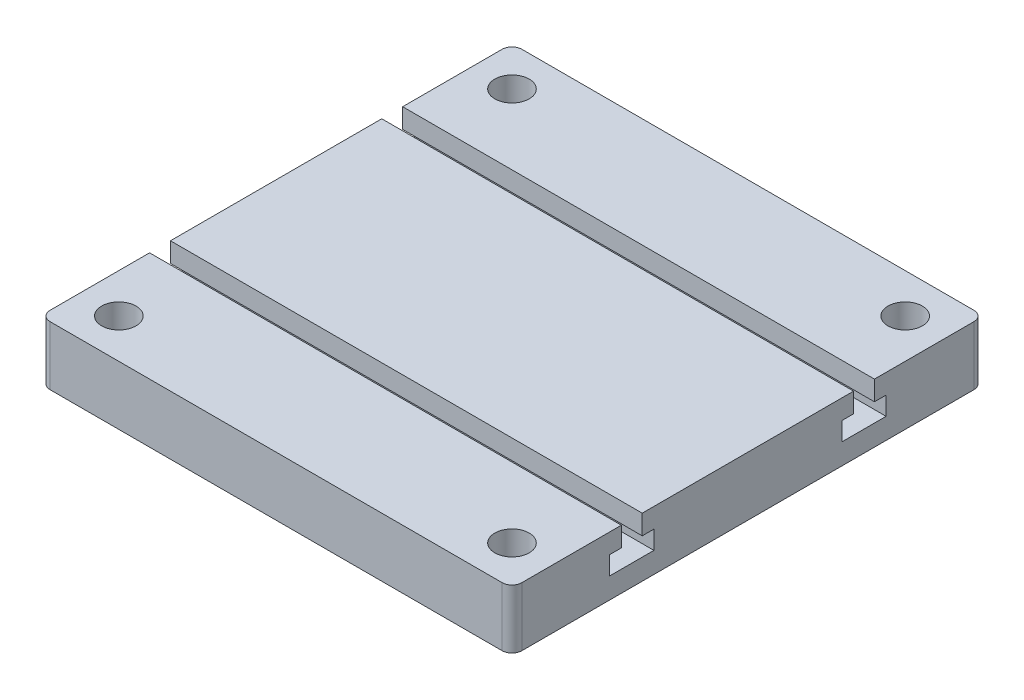
ISO-10303-21;
HEADER;
FILE_DESCRIPTION(('STEP AP214'),'2;1');
FILE_NAME('part.step','',(''),(''),'','','');
FILE_SCHEMA(('AUTOMOTIVE_DESIGN { 1 0 10303 214 1 1 1 1 }'));
ENDSEC;
DATA;
#1=APPLICATION_CONTEXT('core data for automotive mechanical design processes');
#2=APPLICATION_PROTOCOL_DEFINITION('international standard','automotive_design',2000,#1);
#3=PRODUCT_CONTEXT('',#1,'mechanical');
#4=PRODUCT('Part','Part','',(#3));
#5=PRODUCT_RELATED_PRODUCT_CATEGORY('part','',(#4));
#6=PRODUCT_DEFINITION_FORMATION('','',#4);
#7=PRODUCT_DEFINITION_CONTEXT('part definition',#1,'design');
#8=PRODUCT_DEFINITION('design','',#6,#7);
#9=PRODUCT_DEFINITION_SHAPE('','',#8);
#10=(LENGTH_UNIT() NAMED_UNIT(*) SI_UNIT(.MILLI.,.METRE.));
#11=(NAMED_UNIT(*) PLANE_ANGLE_UNIT() SI_UNIT($,.RADIAN.));
#12=(NAMED_UNIT(*) SI_UNIT($,.STERADIAN.) SOLID_ANGLE_UNIT());
#13=UNCERTAINTY_MEASURE_WITH_UNIT(LENGTH_MEASURE(1.E-05),#10,'distance_accuracy_value','');
#14=(GEOMETRIC_REPRESENTATION_CONTEXT(3) GLOBAL_UNCERTAINTY_ASSIGNED_CONTEXT((#13)) GLOBAL_UNIT_ASSIGNED_CONTEXT((#10,
#11,#12)) REPRESENTATION_CONTEXT('',''));
#15=CARTESIAN_POINT('',(0.,0.,0.));
#16=DIRECTION('',(0.,0.,1.));
#17=DIRECTION('',(1.,0.,0.));
#18=AXIS2_PLACEMENT_3D('',#15,#16,#17);
#19=CARTESIAN_POINT('',(76.2,19.05,-76.2));
#20=DIRECTION('',(-1.,0.,0.));
#21=DIRECTION('',(0.,0.,1.));
#22=AXIS2_PLACEMENT_3D('',#19,#20,#21);
#23=PLANE('',#22);
#24=DIRECTION('',(0.,0.,-1.));
#25=VECTOR('',#24,1.);
#26=CARTESIAN_POINT('',(76.2,19.05,-76.2));
#27=LINE('',#26,#25);
#28=CARTESIAN_POINT('',(76.2,19.05,73.0249999999999));
#29=VERTEX_POINT('',#28);
#30=CARTESIAN_POINT('',(76.2,19.05,40.8765375));
#31=VERTEX_POINT('',#30);
#32=EDGE_CURVE('E195',#29,#31,#27,.T.);
#33=ORIENTED_EDGE('',*,*,#32,.F.);
#34=DIRECTION('',(0.,-1.,0.));
#35=VECTOR('',#34,1.);
#36=CARTESIAN_POINT('',(76.2,19.05,73.025));
#37=LINE('',#36,#35);
#38=CARTESIAN_POINT('',(76.2,0.,73.0249999999999));
#39=VERTEX_POINT('',#38);
#40=EDGE_CURVE('E411',#29,#39,#37,.T.);
#41=ORIENTED_EDGE('',*,*,#40,.T.);
#42=DIRECTION('',(0.,0.,-1.));
#43=VECTOR('',#42,1.);
#44=CARTESIAN_POINT('',(76.2,0.,-76.2));
#45=LINE('',#44,#43);
#46=CARTESIAN_POINT('',(76.2,0.,-73.025));
#47=VERTEX_POINT('',#46);
#48=EDGE_CURVE('E369',#39,#47,#45,.T.);
#49=ORIENTED_EDGE('',*,*,#48,.T.);
#50=DIRECTION('',(0.,-1.,0.));
#51=VECTOR('',#50,1.);
#52=CARTESIAN_POINT('',(76.2,19.05,-73.025));
#53=LINE('',#52,#51);
#54=CARTESIAN_POINT('',(76.2,19.05,-73.025));
#55=VERTEX_POINT('',#54);
#56=EDGE_CURVE('E409',#47,#55,#53,.F.);
#57=ORIENTED_EDGE('',*,*,#56,.T.);
#58=CARTESIAN_POINT('',(76.2,19.05,-40.8765375));
#59=VERTEX_POINT('',#58);
#60=EDGE_CURVE('E211',#59,#55,#27,.T.);
#61=ORIENTED_EDGE('',*,*,#60,.F.);
#62=DIRECTION('',(0.,1.,0.));
#63=VECTOR('',#62,1.);
#64=CARTESIAN_POINT('',(76.2,19.05,-40.8765375));
#65=LINE('',#64,#63);
#66=CARTESIAN_POINT('',(76.2,12.7,-40.8765375));
#67=VERTEX_POINT('',#66);
#68=EDGE_CURVE('E281',#67,#59,#65,.T.);
#69=ORIENTED_EDGE('',*,*,#68,.F.);
#70=DIRECTION('',(0.,0.,1.));
#71=VECTOR('',#70,1.);
#72=CARTESIAN_POINT('',(76.2,12.7,-40.8765375));
#73=LINE('',#72,#71);
#74=CARTESIAN_POINT('',(76.2,12.7,-44.64685));
#75=VERTEX_POINT('',#74);
#76=EDGE_CURVE('E279',#75,#67,#73,.T.);
#77=ORIENTED_EDGE('',*,*,#76,.F.);
#78=DIRECTION('',(0.,1.,0.));
#79=VECTOR('',#78,1.);
#80=CARTESIAN_POINT('',(76.2,12.7,-44.64685));
#81=LINE('',#80,#79);
#82=CARTESIAN_POINT('',(76.2,6.746875,-44.64685));
#83=VERTEX_POINT('',#82);
#84=EDGE_CURVE('E277',#83,#75,#81,.T.);
#85=ORIENTED_EDGE('',*,*,#84,.F.);
#86=DIRECTION('',(0.,0.,-1.));
#87=VECTOR('',#86,1.);
#88=CARTESIAN_POINT('',(76.2,6.746875,-44.64685));
#89=LINE('',#88,#87);
#90=CARTESIAN_POINT('',(76.2,6.746875,-30.35935));
#91=VERTEX_POINT('',#90);
#92=EDGE_CURVE('E275',#91,#83,#89,.T.);
#93=ORIENTED_EDGE('',*,*,#92,.F.);
#94=DIRECTION('',(0.,-1.,0.));
#95=VECTOR('',#94,1.);
#96=CARTESIAN_POINT('',(76.2,6.746875,-30.35935));
#97=LINE('',#96,#95);
#98=CARTESIAN_POINT('',(76.2,12.7,-30.35935));
#99=VERTEX_POINT('',#98);
#100=EDGE_CURVE('E272',#99,#91,#97,.T.);
#101=ORIENTED_EDGE('',*,*,#100,.F.);
#102=DIRECTION('',(0.,0.,1.));
#103=VECTOR('',#102,1.);
#104=CARTESIAN_POINT('',(76.2,12.7,-30.35935));
#105=LINE('',#104,#103);
#106=CARTESIAN_POINT('',(76.2,12.7,-34.1296625));
#107=VERTEX_POINT('',#106);
#108=EDGE_CURVE('E270',#107,#99,#105,.T.);
#109=ORIENTED_EDGE('',*,*,#108,.F.);
#110=DIRECTION('',(0.,-1.,0.));
#111=VECTOR('',#110,1.);
#112=CARTESIAN_POINT('',(76.2,12.7,-34.1296625));
#113=LINE('',#112,#111);
#114=CARTESIAN_POINT('',(76.2,19.05,-34.1296625));
#115=VERTEX_POINT('',#114);
#116=EDGE_CURVE('E283',#115,#107,#113,.T.);
#117=ORIENTED_EDGE('',*,*,#116,.F.);
#118=CARTESIAN_POINT('',(76.2,19.05,34.1296625));
#119=VERTEX_POINT('',#118);
#120=EDGE_CURVE('E209',#119,#115,#27,.T.);
#121=ORIENTED_EDGE('',*,*,#120,.F.);
#122=DIRECTION('',(0.,1.,0.));
#123=VECTOR('',#122,1.);
#124=CARTESIAN_POINT('',(76.2,12.7,34.1296625));
#125=LINE('',#124,#123);
#126=CARTESIAN_POINT('',(76.2,12.7,34.1296625));
#127=VERTEX_POINT('',#126);
#128=EDGE_CURVE('E239',#127,#119,#125,.T.);
#129=ORIENTED_EDGE('',*,*,#128,.F.);
#130=DIRECTION('',(0.,0.,1.));
#131=VECTOR('',#130,1.);
#132=CARTESIAN_POINT('',(76.2,12.7,30.35935));
#133=LINE('',#132,#131);
#134=CARTESIAN_POINT('',(76.2,12.7,30.35935));
#135=VERTEX_POINT('',#134);
#136=EDGE_CURVE('E237',#135,#127,#133,.T.);
#137=ORIENTED_EDGE('',*,*,#136,.F.);
#138=DIRECTION('',(0.,1.,0.));
#139=VECTOR('',#138,1.);
#140=CARTESIAN_POINT('',(76.2,6.746875,30.35935));
#141=LINE('',#140,#139);
#142=CARTESIAN_POINT('',(76.2,6.746875,30.35935));
#143=VERTEX_POINT('',#142);
#144=EDGE_CURVE('E235',#143,#135,#141,.T.);
#145=ORIENTED_EDGE('',*,*,#144,.F.);
#146=DIRECTION('',(0.,0.,-1.));
#147=VECTOR('',#146,1.);
#148=CARTESIAN_POINT('',(76.2,6.746875,44.64685));
#149=LINE('',#148,#147);
#150=CARTESIAN_POINT('',(76.2,6.746875,44.64685));
#151=VERTEX_POINT('',#150);
#152=EDGE_CURVE('E233',#151,#143,#149,.T.);
#153=ORIENTED_EDGE('',*,*,#152,.F.);
#154=DIRECTION('',(0.,-1.,0.));
#155=VECTOR('',#154,1.);
#156=CARTESIAN_POINT('',(76.2,12.7,44.64685));
#157=LINE('',#156,#155);
#158=CARTESIAN_POINT('',(76.2,12.7,44.64685));
#159=VERTEX_POINT('',#158);
#160=EDGE_CURVE('E226',#159,#151,#157,.T.);
#161=ORIENTED_EDGE('',*,*,#160,.F.);
#162=DIRECTION('',(0.,0.,1.));
#163=VECTOR('',#162,1.);
#164=CARTESIAN_POINT('',(76.2,12.7,40.8765375));
#165=LINE('',#164,#163);
#166=CARTESIAN_POINT('',(76.2,12.7,40.8765375));
#167=VERTEX_POINT('',#166);
#168=EDGE_CURVE('E223',#167,#159,#165,.T.);
#169=ORIENTED_EDGE('',*,*,#168,.F.);
#170=DIRECTION('',(0.,-1.,0.));
#171=VECTOR('',#170,1.);
#172=CARTESIAN_POINT('',(76.2,19.05,40.8765375));
#173=LINE('',#172,#171);
#174=EDGE_CURVE('E214',#31,#167,#173,.T.);
#175=ORIENTED_EDGE('',*,*,#174,.F.);
#176=EDGE_LOOP('',(#33,#41,#49,#57,#61,#69,#77,#85,#93,#101,#109,#117,#121,#129,#137,#145,#153,
#161,#169,#175));
#177=FACE_BOUND('',#176,.T.);
#178=ADVANCED_FACE('F34',(#177),#23,.F.);
#179=CARTESIAN_POINT('',(-76.2,19.05,-76.2));
#180=DIRECTION('',(1.,0.,0.));
#181=DIRECTION('',(0.,0.,-1.));
#182=AXIS2_PLACEMENT_3D('',#179,#180,#181);
#183=PLANE('',#182);
#184=DIRECTION('',(0.,0.,1.));
#185=VECTOR('',#184,1.);
#186=CARTESIAN_POINT('',(-76.2,0.,-76.2));
#187=LINE('',#186,#185);
#188=CARTESIAN_POINT('',(-76.2,0.,-73.025));
#189=VERTEX_POINT('',#188);
#190=CARTESIAN_POINT('',(-76.2,0.,73.0249999999999));
#191=VERTEX_POINT('',#190);
#192=EDGE_CURVE('E383',#189,#191,#187,.T.);
#193=ORIENTED_EDGE('',*,*,#192,.T.);
#194=DIRECTION('',(0.,-1.,0.));
#195=VECTOR('',#194,1.);
#196=CARTESIAN_POINT('',(-76.2,19.05,73.025));
#197=LINE('',#196,#195);
#198=CARTESIAN_POINT('',(-76.2,19.05,73.0249999999999));
#199=VERTEX_POINT('',#198);
#200=EDGE_CURVE('E404',#191,#199,#197,.F.);
#201=ORIENTED_EDGE('',*,*,#200,.T.);
#202=DIRECTION('',(0.,0.,1.));
#203=VECTOR('',#202,1.);
#204=CARTESIAN_POINT('',(-76.2,19.05,-76.2));
#205=LINE('',#204,#203);
#206=CARTESIAN_POINT('',(-76.2,19.05,40.8765375));
#207=VERTEX_POINT('',#206);
#208=EDGE_CURVE('E372',#207,#199,#205,.T.);
#209=ORIENTED_EDGE('',*,*,#208,.F.);
#210=DIRECTION('',(0.,-1.,0.));
#211=VECTOR('',#210,1.);
#212=CARTESIAN_POINT('',(-76.2,19.05,40.8765375));
#213=LINE('',#212,#211);
#214=CARTESIAN_POINT('',(-76.2,12.7,40.8765375));
#215=VERTEX_POINT('',#214);
#216=EDGE_CURVE('E217',#207,#215,#213,.T.);
#217=ORIENTED_EDGE('',*,*,#216,.T.);
#218=DIRECTION('',(0.,0.,1.));
#219=VECTOR('',#218,1.);
#220=CARTESIAN_POINT('',(-76.2,12.7,40.8765375));
#221=LINE('',#220,#219);
#222=CARTESIAN_POINT('',(-76.2,12.7,44.64685));
#223=VERTEX_POINT('',#222);
#224=EDGE_CURVE('E243',#215,#223,#221,.T.);
#225=ORIENTED_EDGE('',*,*,#224,.T.);
#226=DIRECTION('',(0.,-1.,0.));
#227=VECTOR('',#226,1.);
#228=CARTESIAN_POINT('',(-76.2,12.7,44.64685));
#229=LINE('',#228,#227);
#230=CARTESIAN_POINT('',(-76.2,6.746875,44.64685));
#231=VERTEX_POINT('',#230);
#232=EDGE_CURVE('E247',#223,#231,#229,.T.);
#233=ORIENTED_EDGE('',*,*,#232,.T.);
#234=DIRECTION('',(0.,0.,-1.));
#235=VECTOR('',#234,1.);
#236=CARTESIAN_POINT('',(-76.2,6.746875,44.64685));
#237=LINE('',#236,#235);
#238=CARTESIAN_POINT('',(-76.2,6.746875,30.35935));
#239=VERTEX_POINT('',#238);
#240=EDGE_CURVE('E250',#231,#239,#237,.T.);
#241=ORIENTED_EDGE('',*,*,#240,.T.);
#242=DIRECTION('',(0.,1.,0.));
#243=VECTOR('',#242,1.);
#244=CARTESIAN_POINT('',(-76.2,6.746875,30.35935));
#245=LINE('',#244,#243);
#246=CARTESIAN_POINT('',(-76.2,12.7,30.35935));
#247=VERTEX_POINT('',#246);
#248=EDGE_CURVE('E253',#239,#247,#245,.T.);
#249=ORIENTED_EDGE('',*,*,#248,.T.);
#250=DIRECTION('',(0.,0.,1.));
#251=VECTOR('',#250,1.);
#252=CARTESIAN_POINT('',(-76.2,12.7,30.35935));
#253=LINE('',#252,#251);
#254=CARTESIAN_POINT('',(-76.2,12.7,34.1296625));
#255=VERTEX_POINT('',#254);
#256=EDGE_CURVE('E229',#247,#255,#253,.T.);
#257=ORIENTED_EDGE('',*,*,#256,.T.);
#258=DIRECTION('',(0.,1.,0.));
#259=VECTOR('',#258,1.);
#260=CARTESIAN_POINT('',(-76.2,12.7,34.1296625));
#261=LINE('',#260,#259);
#262=CARTESIAN_POINT('',(-76.2,19.05,34.1296625));
#263=VERTEX_POINT('',#262);
#264=EDGE_CURVE('E224',#255,#263,#261,.T.);
#265=ORIENTED_EDGE('',*,*,#264,.T.);
#266=CARTESIAN_POINT('',(-76.2,19.05,-34.1296625));
#267=VERTEX_POINT('',#266);
#268=EDGE_CURVE('E376',#267,#263,#205,.T.);
#269=ORIENTED_EDGE('',*,*,#268,.F.);
#270=DIRECTION('',(0.,-1.,0.));
#271=VECTOR('',#270,1.);
#272=CARTESIAN_POINT('',(-76.2,12.7,-34.1296625));
#273=LINE('',#272,#271);
#274=CARTESIAN_POINT('',(-76.2,12.7,-34.1296625));
#275=VERTEX_POINT('',#274);
#276=EDGE_CURVE('E273',#267,#275,#273,.T.);
#277=ORIENTED_EDGE('',*,*,#276,.T.);
#278=DIRECTION('',(0.,0.,1.));
#279=VECTOR('',#278,1.);
#280=CARTESIAN_POINT('',(-76.2,12.7,-30.35935));
#281=LINE('',#280,#279);
#282=CARTESIAN_POINT('',(-76.2,12.7,-30.35935));
#283=VERTEX_POINT('',#282);
#284=EDGE_CURVE('E286',#275,#283,#281,.T.);
#285=ORIENTED_EDGE('',*,*,#284,.T.);
#286=DIRECTION('',(0.,-1.,0.));
#287=VECTOR('',#286,1.);
#288=CARTESIAN_POINT('',(-76.2,6.746875,-30.35935));
#289=LINE('',#288,#287);
#290=CARTESIAN_POINT('',(-76.2,6.746875,-30.35935));
#291=VERTEX_POINT('',#290);
#292=EDGE_CURVE('E289',#283,#291,#289,.T.);
#293=ORIENTED_EDGE('',*,*,#292,.T.);
#294=DIRECTION('',(0.,0.,-1.));
#295=VECTOR('',#294,1.);
#296=CARTESIAN_POINT('',(-76.2,6.746875,-44.64685));
#297=LINE('',#296,#295);
#298=CARTESIAN_POINT('',(-76.2,6.746875,-44.64685));
#299=VERTEX_POINT('',#298);
#300=EDGE_CURVE('E292',#291,#299,#297,.T.);
#301=ORIENTED_EDGE('',*,*,#300,.T.);
#302=DIRECTION('',(0.,1.,0.));
#303=VECTOR('',#302,1.);
#304=CARTESIAN_POINT('',(-76.2,12.7,-44.64685));
#305=LINE('',#304,#303);
#306=CARTESIAN_POINT('',(-76.2,12.7,-44.64685));
#307=VERTEX_POINT('',#306);
#308=EDGE_CURVE('E295',#299,#307,#305,.T.);
#309=ORIENTED_EDGE('',*,*,#308,.T.);
#310=DIRECTION('',(0.,0.,1.));
#311=VECTOR('',#310,1.);
#312=CARTESIAN_POINT('',(-76.2,12.7,-40.8765375));
#313=LINE('',#312,#311);
#314=CARTESIAN_POINT('',(-76.2,12.7,-40.8765375));
#315=VERTEX_POINT('',#314);
#316=EDGE_CURVE('E298',#307,#315,#313,.T.);
#317=ORIENTED_EDGE('',*,*,#316,.T.);
#318=DIRECTION('',(0.,1.,0.));
#319=VECTOR('',#318,1.);
#320=CARTESIAN_POINT('',(-76.2,19.05,-40.8765375));
#321=LINE('',#320,#319);
#322=CARTESIAN_POINT('',(-76.2,19.05,-40.8765375));
#323=VERTEX_POINT('',#322);
#324=EDGE_CURVE('E301',#315,#323,#321,.T.);
#325=ORIENTED_EDGE('',*,*,#324,.T.);
#326=CARTESIAN_POINT('',(-76.2,19.05,-73.025));
#327=VERTEX_POINT('',#326);
#328=EDGE_CURVE('E373',#327,#323,#205,.T.);
#329=ORIENTED_EDGE('',*,*,#328,.F.);
#330=DIRECTION('',(0.,-1.,0.));
#331=VECTOR('',#330,1.);
#332=CARTESIAN_POINT('',(-76.2,19.05,-73.025));
#333=LINE('',#332,#331);
#334=EDGE_CURVE('E401',#327,#189,#333,.T.);
#335=ORIENTED_EDGE('',*,*,#334,.T.);
#336=EDGE_LOOP('',(#193,#201,#209,#217,#225,#233,#241,#249,#257,#265,#269,#277,#285,#293,#301,
#309,#317,#325,#329,#335));
#337=FACE_BOUND('',#336,.T.);
#338=ADVANCED_FACE('F423',(#337),#183,.F.);
#339=CARTESIAN_POINT('',(0.,19.05,0.));
#340=DIRECTION('',(0.,1.,0.));
#341=DIRECTION('',(0.,0.,1.));
#342=AXIS2_PLACEMENT_3D('',#339,#340,#341);
#343=PLANE('',#342);
#344=CARTESIAN_POINT('',(-63.5,19.05,63.5));
#345=DIRECTION('',(0.,1.,0.));
#346=DIRECTION('',(0.,0.,1.));
#347=AXIS2_PLACEMENT_3D('',#344,#345,#346);
#348=CIRCLE('',#347,5.55625);
#349=CARTESIAN_POINT('',(-63.5,19.05,69.05625));
#350=VERTEX_POINT('',#349);
#351=EDGE_CURVE('E358',#350,#350,#348,.T.);
#352=ORIENTED_EDGE('',*,*,#351,.F.);
#353=EDGE_LOOP('',(#352));
#354=FACE_BOUND('',#353,.T.);
#355=CARTESIAN_POINT('',(63.5,19.05,63.5));
#356=DIRECTION('',(0.,1.,0.));
#357=DIRECTION('',(0.,0.,1.));
#358=AXIS2_PLACEMENT_3D('',#355,#356,#357);
#359=CIRCLE('',#358,5.55625);
#360=CARTESIAN_POINT('',(63.5,19.05,69.05625));
#361=VERTEX_POINT('',#360);
#362=EDGE_CURVE('E346',#361,#361,#359,.T.);
#363=ORIENTED_EDGE('',*,*,#362,.F.);
#364=EDGE_LOOP('',(#363));
#365=FACE_BOUND('',#364,.T.);
#366=ORIENTED_EDGE('',*,*,#208,.T.);
#367=CARTESIAN_POINT('',(-73.025,19.05,73.025));
#368=DIRECTION('',(0.,1.,0.));
#369=DIRECTION('',(0.,0.,1.));
#370=AXIS2_PLACEMENT_3D('',#367,#368,#369);
#371=CIRCLE('',#370,3.175);
#372=CARTESIAN_POINT('',(-73.025,19.05,76.2));
#373=VERTEX_POINT('',#372);
#374=EDGE_CURVE('E407',#199,#373,#371,.T.);
#375=ORIENTED_EDGE('',*,*,#374,.T.);
#376=DIRECTION('',(1.,0.,0.));
#377=VECTOR('',#376,1.);
#378=CARTESIAN_POINT('',(-76.2,19.05,76.2));
#379=LINE('',#378,#377);
#380=CARTESIAN_POINT('',(73.025,19.05,76.2));
#381=VERTEX_POINT('',#380);
#382=EDGE_CURVE('E375',#373,#381,#379,.T.);
#383=ORIENTED_EDGE('',*,*,#382,.T.);
#384=CARTESIAN_POINT('',(73.025,19.05,73.025));
#385=DIRECTION('',(0.,1.,0.));
#386=DIRECTION('',(0.,0.,1.));
#387=AXIS2_PLACEMENT_3D('',#384,#385,#386);
#388=CIRCLE('',#387,3.175);
#389=EDGE_CURVE('E203',#381,#29,#388,.T.);
#390=ORIENTED_EDGE('',*,*,#389,.T.);
#391=ORIENTED_EDGE('',*,*,#32,.T.);
#392=DIRECTION('',(-1.,0.,0.));
#393=VECTOR('',#392,1.);
#394=CARTESIAN_POINT('',(76.2,19.05,40.8765375));
#395=LINE('',#394,#393);
#396=EDGE_CURVE('E199',#31,#207,#395,.T.);
#397=ORIENTED_EDGE('',*,*,#396,.T.);
#398=EDGE_LOOP('',(#366,#375,#383,#390,#391,#397));
#399=FACE_BOUND('',#398,.T.);
#400=ADVANCED_FACE('F198',(#354,#365,#399),#343,.T.);
#401=ORIENTED_EDGE('',*,*,#268,.T.);
#402=DIRECTION('',(-1.,0.,0.));
#403=VECTOR('',#402,1.);
#404=CARTESIAN_POINT('',(76.2,19.05,34.1296625));
#405=LINE('',#404,#403);
#406=EDGE_CURVE('E241',#119,#263,#405,.T.);
#407=ORIENTED_EDGE('',*,*,#406,.F.);
#408=ORIENTED_EDGE('',*,*,#120,.T.);
#409=DIRECTION('',(-1.,0.,0.));
#410=VECTOR('',#409,1.);
#411=CARTESIAN_POINT('',(76.2,19.05,-34.1296625));
#412=LINE('',#411,#410);
#413=EDGE_CURVE('E307',#115,#267,#412,.T.);
#414=ORIENTED_EDGE('',*,*,#413,.T.);
#415=EDGE_LOOP('',(#401,#407,#408,#414));
#416=FACE_BOUND('',#415,.T.);
#417=ADVANCED_FACE('F452',(#416),#343,.T.);
#418=CARTESIAN_POINT('',(-63.5,19.05,-63.5));
#419=DIRECTION('',(0.,1.,0.));
#420=DIRECTION('',(0.,0.,1.));
#421=AXIS2_PLACEMENT_3D('',#418,#419,#420);
#422=CIRCLE('',#421,5.55625);
#423=CARTESIAN_POINT('',(-63.5,19.05,-57.94375));
#424=VERTEX_POINT('',#423);
#425=EDGE_CURVE('E218',#424,#424,#422,.T.);
#426=ORIENTED_EDGE('',*,*,#425,.F.);
#427=EDGE_LOOP('',(#426));
#428=FACE_BOUND('',#427,.T.);
#429=CARTESIAN_POINT('',(63.5,19.05,-63.5));
#430=DIRECTION('',(0.,1.,0.));
#431=DIRECTION('',(0.,0.,1.));
#432=AXIS2_PLACEMENT_3D('',#429,#430,#431);
#433=CIRCLE('',#432,5.55625);
#434=CARTESIAN_POINT('',(63.5,19.05,-57.94375));
#435=VERTEX_POINT('',#434);
#436=EDGE_CURVE('E334',#435,#435,#433,.T.);
#437=ORIENTED_EDGE('',*,*,#436,.F.);
#438=EDGE_LOOP('',(#437));
#439=FACE_BOUND('',#438,.T.);
#440=ORIENTED_EDGE('',*,*,#60,.T.);
#441=CARTESIAN_POINT('',(73.025,19.05,-73.025));
#442=DIRECTION('',(0.,1.,0.));
#443=DIRECTION('',(0.,0.,1.));
#444=AXIS2_PLACEMENT_3D('',#441,#442,#443);
#445=CIRCLE('',#444,3.175);
#446=CARTESIAN_POINT('',(73.025,19.05,-76.2));
#447=VERTEX_POINT('',#446);
#448=EDGE_CURVE('E11',#55,#447,#445,.T.);
#449=ORIENTED_EDGE('',*,*,#448,.T.);
#450=DIRECTION('',(-1.,0.,0.));
#451=VECTOR('',#450,1.);
#452=CARTESIAN_POINT('',(-76.2,19.05,-76.2));
#453=LINE('',#452,#451);
#454=CARTESIAN_POINT('',(-73.025,19.05,-76.2));
#455=VERTEX_POINT('',#454);
#456=EDGE_CURVE('E208',#447,#455,#453,.T.);
#457=ORIENTED_EDGE('',*,*,#456,.T.);
#458=CARTESIAN_POINT('',(-73.025,19.05,-73.025));
#459=DIRECTION('',(0.,1.,0.));
#460=DIRECTION('',(0.,0.,1.));
#461=AXIS2_PLACEMENT_3D('',#458,#459,#460);
#462=CIRCLE('',#461,3.175);
#463=EDGE_CURVE('E42',#455,#327,#462,.T.);
#464=ORIENTED_EDGE('',*,*,#463,.T.);
#465=ORIENTED_EDGE('',*,*,#328,.T.);
#466=DIRECTION('',(-1.,0.,0.));
#467=VECTOR('',#466,1.);
#468=CARTESIAN_POINT('',(76.2,19.05,-40.8765375));
#469=LINE('',#468,#467);
#470=EDGE_CURVE('E310',#59,#323,#469,.T.);
#471=ORIENTED_EDGE('',*,*,#470,.F.);
#472=EDGE_LOOP('',(#440,#449,#457,#464,#465,#471));
#473=FACE_BOUND('',#472,.T.);
#474=ADVANCED_FACE('F418',(#428,#439,#473),#343,.T.);
#475=CARTESIAN_POINT('',(-76.2,19.05,-76.2));
#476=DIRECTION('',(0.,0.,1.));
#477=DIRECTION('',(1.,0.,0.));
#478=AXIS2_PLACEMENT_3D('',#475,#476,#477);
#479=PLANE('',#478);
#480=ORIENTED_EDGE('',*,*,#456,.F.);
#481=DIRECTION('',(0.,-1.,0.));
#482=VECTOR('',#481,1.);
#483=CARTESIAN_POINT('',(73.025,19.05,-76.2));
#484=LINE('',#483,#482);
#485=CARTESIAN_POINT('',(73.025,0.,-76.2));
#486=VERTEX_POINT('',#485);
#487=EDGE_CURVE('E414',#447,#486,#484,.T.);
#488=ORIENTED_EDGE('',*,*,#487,.T.);
#489=DIRECTION('',(-1.,0.,0.));
#490=VECTOR('',#489,1.);
#491=CARTESIAN_POINT('',(-76.2,0.,-76.2));
#492=LINE('',#491,#490);
#493=CARTESIAN_POINT('',(-73.025,0.,-76.2));
#494=VERTEX_POINT('',#493);
#495=EDGE_CURVE('E381',#486,#494,#492,.T.);
#496=ORIENTED_EDGE('',*,*,#495,.T.);
#497=DIRECTION('',(0.,-1.,0.));
#498=VECTOR('',#497,1.);
#499=CARTESIAN_POINT('',(-73.025,19.05,-76.2));
#500=LINE('',#499,#498);
#501=EDGE_CURVE('E49',#494,#455,#500,.F.);
#502=ORIENTED_EDGE('',*,*,#501,.T.);
#503=EDGE_LOOP('',(#480,#488,#496,#502));
#504=FACE_BOUND('',#503,.T.);
#505=ADVANCED_FACE('F430',(#504),#479,.F.);
#506=CARTESIAN_POINT('',(-76.2,19.05,76.2));
#507=DIRECTION('',(0.,0.,-1.));
#508=DIRECTION('',(-1.,0.,0.));
#509=AXIS2_PLACEMENT_3D('',#506,#507,#508);
#510=PLANE('',#509);
#511=ORIENTED_EDGE('',*,*,#382,.F.);
#512=DIRECTION('',(0.,-1.,0.));
#513=VECTOR('',#512,1.);
#514=CARTESIAN_POINT('',(-73.025,19.05,76.2));
#515=LINE('',#514,#513);
#516=CARTESIAN_POINT('',(-73.025,0.,76.2));
#517=VERTEX_POINT('',#516);
#518=EDGE_CURVE('E390',#373,#517,#515,.T.);
#519=ORIENTED_EDGE('',*,*,#518,.T.);
#520=DIRECTION('',(1.,0.,0.));
#521=VECTOR('',#520,1.);
#522=CARTESIAN_POINT('',(-76.2,0.,76.2));
#523=LINE('',#522,#521);
#524=CARTESIAN_POINT('',(73.025,0.,76.2));
#525=VERTEX_POINT('',#524);
#526=EDGE_CURVE('E386',#517,#525,#523,.T.);
#527=ORIENTED_EDGE('',*,*,#526,.T.);
#528=DIRECTION('',(0.,-1.,0.));
#529=VECTOR('',#528,1.);
#530=CARTESIAN_POINT('',(73.025,19.05,76.2));
#531=LINE('',#530,#529);
#532=EDGE_CURVE('E378',#525,#381,#531,.F.);
#533=ORIENTED_EDGE('',*,*,#532,.T.);
#534=EDGE_LOOP('',(#511,#519,#527,#533));
#535=FACE_BOUND('',#534,.T.);
#536=ADVANCED_FACE('F442',(#535),#510,.F.);
#537=CARTESIAN_POINT('',(0.,0.,0.));
#538=DIRECTION('',(0.,1.,0.));
#539=DIRECTION('',(0.,0.,1.));
#540=AXIS2_PLACEMENT_3D('',#537,#538,#539);
#541=PLANE('',#540);
#542=CARTESIAN_POINT('',(-63.5,0.,-63.5));
#543=DIRECTION('',(0.,1.,0.));
#544=DIRECTION('',(0.,0.,1.));
#545=AXIS2_PLACEMENT_3D('',#542,#543,#544);
#546=CIRCLE('',#545,3.26389999999999);
#547=CARTESIAN_POINT('',(-63.5,0.,-60.2361));
#548=VERTEX_POINT('',#547);
#549=EDGE_CURVE('E331',#548,#548,#546,.T.);
#550=ORIENTED_EDGE('',*,*,#549,.T.);
#551=EDGE_LOOP('',(#550));
#552=FACE_BOUND('',#551,.T.);
#553=CARTESIAN_POINT('',(63.5,0.,-63.5));
#554=DIRECTION('',(0.,1.,0.));
#555=DIRECTION('',(0.,0.,1.));
#556=AXIS2_PLACEMENT_3D('',#553,#554,#555);
#557=CIRCLE('',#556,3.2639);
#558=CARTESIAN_POINT('',(63.5,0.,-60.2361));
#559=VERTEX_POINT('',#558);
#560=EDGE_CURVE('E343',#559,#559,#557,.T.);
#561=ORIENTED_EDGE('',*,*,#560,.T.);
#562=EDGE_LOOP('',(#561));
#563=FACE_BOUND('',#562,.T.);
#564=CARTESIAN_POINT('',(63.5,0.,63.5));
#565=DIRECTION('',(0.,1.,0.));
#566=DIRECTION('',(0.,0.,1.));
#567=AXIS2_PLACEMENT_3D('',#564,#565,#566);
#568=CIRCLE('',#567,3.2639);
#569=CARTESIAN_POINT('',(63.5,0.,66.7639));
#570=VERTEX_POINT('',#569);
#571=EDGE_CURVE('E355',#570,#570,#568,.T.);
#572=ORIENTED_EDGE('',*,*,#571,.T.);
#573=EDGE_LOOP('',(#572));
#574=FACE_BOUND('',#573,.T.);
#575=CARTESIAN_POINT('',(-63.5,0.,63.5));
#576=DIRECTION('',(0.,1.,0.));
#577=DIRECTION('',(0.,0.,1.));
#578=AXIS2_PLACEMENT_3D('',#575,#576,#577);
#579=CIRCLE('',#578,3.26389999999999);
#580=CARTESIAN_POINT('',(-63.5,0.,66.7639));
#581=VERTEX_POINT('',#580);
#582=EDGE_CURVE('E367',#581,#581,#579,.T.);
#583=ORIENTED_EDGE('',*,*,#582,.T.);
#584=EDGE_LOOP('',(#583));
#585=FACE_BOUND('',#584,.T.);
#586=ORIENTED_EDGE('',*,*,#526,.F.);
#587=CARTESIAN_POINT('',(-73.025,0.,73.025));
#588=DIRECTION('',(0.,1.,0.));
#589=DIRECTION('',(0.,0.,1.));
#590=AXIS2_PLACEMENT_3D('',#587,#588,#589);
#591=CIRCLE('',#590,3.175);
#592=EDGE_CURVE('E399',#517,#191,#591,.F.);
#593=ORIENTED_EDGE('',*,*,#592,.T.);
#594=ORIENTED_EDGE('',*,*,#192,.F.);
#595=CARTESIAN_POINT('',(-73.025,0.,-73.025));
#596=DIRECTION('',(0.,1.,0.));
#597=DIRECTION('',(0.,0.,1.));
#598=AXIS2_PLACEMENT_3D('',#595,#596,#597);
#599=CIRCLE('',#598,3.175);
#600=EDGE_CURVE('E393',#189,#494,#599,.F.);
#601=ORIENTED_EDGE('',*,*,#600,.T.);
#602=ORIENTED_EDGE('',*,*,#495,.F.);
#603=CARTESIAN_POINT('',(73.025,0.,-73.025));
#604=DIRECTION('',(0.,1.,0.));
#605=DIRECTION('',(0.,0.,1.));
#606=AXIS2_PLACEMENT_3D('',#603,#604,#605);
#607=CIRCLE('',#606,3.175);
#608=EDGE_CURVE('E395',#486,#47,#607,.F.);
#609=ORIENTED_EDGE('',*,*,#608,.T.);
#610=ORIENTED_EDGE('',*,*,#48,.F.);
#611=CARTESIAN_POINT('',(73.025,0.,73.025));
#612=DIRECTION('',(0.,1.,0.));
#613=DIRECTION('',(0.,0.,1.));
#614=AXIS2_PLACEMENT_3D('',#611,#612,#613);
#615=CIRCLE('',#614,3.175);
#616=EDGE_CURVE('E397',#39,#525,#615,.F.);
#617=ORIENTED_EDGE('',*,*,#616,.T.);
#618=EDGE_LOOP('',(#586,#593,#594,#601,#602,#609,#610,#617));
#619=FACE_BOUND('',#618,.T.);
#620=ADVANCED_FACE('F429',(#552,#563,#574,#585,#619),#541,.F.);
#621=CARTESIAN_POINT('',(-63.5,19.05,63.5));
#622=DIRECTION('',(0.,1.,0.));
#623=DIRECTION('',(0.,0.,1.));
#624=AXIS2_PLACEMENT_3D('',#621,#622,#623);
#625=CYLINDRICAL_SURFACE('',#624,3.2639);
#626=ORIENTED_EDGE('',*,*,#582,.F.);
#627=EDGE_LOOP('',(#626));
#628=FACE_BOUND('',#627,.T.);
#629=CARTESIAN_POINT('',(-63.5,10.16,63.5));
#630=DIRECTION('',(0.,1.,0.));
#631=DIRECTION('',(0.,0.,1.));
#632=AXIS2_PLACEMENT_3D('',#629,#630,#631);
#633=CIRCLE('',#632,3.2639);
#634=CARTESIAN_POINT('',(-63.5,10.16,66.7639));
#635=VERTEX_POINT('',#634);
#636=EDGE_CURVE('E364',#635,#635,#633,.T.);
#637=ORIENTED_EDGE('',*,*,#636,.T.);
#638=EDGE_LOOP('',(#637));
#639=FACE_BOUND('',#638,.T.);
#640=ADVANCED_FACE('F547',(#628,#639),#625,.F.);
#641=CARTESIAN_POINT('',(-60.2361,10.16,63.5));
#642=DIRECTION('',(0.,-1.,0.));
#643=DIRECTION('',(0.,0.,-1.));
#644=AXIS2_PLACEMENT_3D('',#641,#642,#643);
#645=PLANE('',#644);
#646=ORIENTED_EDGE('',*,*,#636,.F.);
#647=EDGE_LOOP('',(#646));
#648=FACE_BOUND('',#647,.T.);
#649=CARTESIAN_POINT('',(-63.5,10.16,63.5));
#650=DIRECTION('',(0.,1.,0.));
#651=DIRECTION('',(0.,0.,1.));
#652=AXIS2_PLACEMENT_3D('',#649,#650,#651);
#653=CIRCLE('',#652,5.55625);
#654=CARTESIAN_POINT('',(-63.5,10.16,69.05625));
#655=VERTEX_POINT('',#654);
#656=EDGE_CURVE('E361',#655,#655,#653,.T.);
#657=ORIENTED_EDGE('',*,*,#656,.T.);
#658=EDGE_LOOP('',(#657));
#659=FACE_BOUND('',#658,.T.);
#660=ADVANCED_FACE('F810',(#648,#659),#645,.F.);
#661=CARTESIAN_POINT('',(-63.5,19.05,63.5));
#662=DIRECTION('',(0.,1.,0.));
#663=DIRECTION('',(0.,0.,1.));
#664=AXIS2_PLACEMENT_3D('',#661,#662,#663);
#665=CYLINDRICAL_SURFACE('',#664,5.55625);
#666=ORIENTED_EDGE('',*,*,#656,.F.);
#667=EDGE_LOOP('',(#666));
#668=FACE_BOUND('',#667,.T.);
#669=ORIENTED_EDGE('',*,*,#351,.T.);
#670=EDGE_LOOP('',(#669));
#671=FACE_BOUND('',#670,.T.);
#672=ADVANCED_FACE('F800',(#668,#671),#665,.F.);
#673=CARTESIAN_POINT('',(63.5,19.05,63.5));
#674=DIRECTION('',(0.,1.,0.));
#675=DIRECTION('',(0.,0.,1.));
#676=AXIS2_PLACEMENT_3D('',#673,#674,#675);
#677=CYLINDRICAL_SURFACE('',#676,3.2639);
#678=ORIENTED_EDGE('',*,*,#571,.F.);
#679=EDGE_LOOP('',(#678));
#680=FACE_BOUND('',#679,.T.);
#681=CARTESIAN_POINT('',(63.5,10.16,63.5));
#682=DIRECTION('',(0.,1.,0.));
#683=DIRECTION('',(0.,0.,1.));
#684=AXIS2_PLACEMENT_3D('',#681,#682,#683);
#685=CIRCLE('',#684,3.2639);
#686=CARTESIAN_POINT('',(63.5,10.16,66.7639));
#687=VERTEX_POINT('',#686);
#688=EDGE_CURVE('E352',#687,#687,#685,.T.);
#689=ORIENTED_EDGE('',*,*,#688,.T.);
#690=EDGE_LOOP('',(#689));
#691=FACE_BOUND('',#690,.T.);
#692=ADVANCED_FACE('F790',(#680,#691),#677,.F.);
#693=CARTESIAN_POINT('',(66.7639,10.16,63.5));
#694=DIRECTION('',(0.,-1.,0.));
#695=DIRECTION('',(0.,0.,-1.));
#696=AXIS2_PLACEMENT_3D('',#693,#694,#695);
#697=PLANE('',#696);
#698=ORIENTED_EDGE('',*,*,#688,.F.);
#699=EDGE_LOOP('',(#698));
#700=FACE_BOUND('',#699,.T.);
#701=CARTESIAN_POINT('',(63.5,10.16,63.5));
#702=DIRECTION('',(0.,1.,0.));
#703=DIRECTION('',(0.,0.,1.));
#704=AXIS2_PLACEMENT_3D('',#701,#702,#703);
#705=CIRCLE('',#704,5.55625);
#706=CARTESIAN_POINT('',(63.5,10.16,69.05625));
#707=VERTEX_POINT('',#706);
#708=EDGE_CURVE('E349',#707,#707,#705,.T.);
#709=ORIENTED_EDGE('',*,*,#708,.T.);
#710=EDGE_LOOP('',(#709));
#711=FACE_BOUND('',#710,.T.);
#712=ADVANCED_FACE('F780',(#700,#711),#697,.F.);
#713=CARTESIAN_POINT('',(63.5,19.05,63.5));
#714=DIRECTION('',(0.,1.,0.));
#715=DIRECTION('',(0.,0.,1.));
#716=AXIS2_PLACEMENT_3D('',#713,#714,#715);
#717=CYLINDRICAL_SURFACE('',#716,5.55625);
#718=ORIENTED_EDGE('',*,*,#708,.F.);
#719=EDGE_LOOP('',(#718));
#720=FACE_BOUND('',#719,.T.);
#721=ORIENTED_EDGE('',*,*,#362,.T.);
#722=EDGE_LOOP('',(#721));
#723=FACE_BOUND('',#722,.T.);
#724=ADVANCED_FACE('F770',(#720,#723),#717,.F.);
#725=CARTESIAN_POINT('',(63.5,19.05,-63.5));
#726=DIRECTION('',(0.,1.,0.));
#727=DIRECTION('',(0.,0.,1.));
#728=AXIS2_PLACEMENT_3D('',#725,#726,#727);
#729=CYLINDRICAL_SURFACE('',#728,3.2639);
#730=ORIENTED_EDGE('',*,*,#560,.F.);
#731=EDGE_LOOP('',(#730));
#732=FACE_BOUND('',#731,.T.);
#733=CARTESIAN_POINT('',(63.5,10.16,-63.5));
#734=DIRECTION('',(0.,1.,0.));
#735=DIRECTION('',(0.,0.,1.));
#736=AXIS2_PLACEMENT_3D('',#733,#734,#735);
#737=CIRCLE('',#736,3.2639);
#738=CARTESIAN_POINT('',(63.5,10.16,-60.2361));
#739=VERTEX_POINT('',#738);
#740=EDGE_CURVE('E340',#739,#739,#737,.T.);
#741=ORIENTED_EDGE('',*,*,#740,.T.);
#742=EDGE_LOOP('',(#741));
#743=FACE_BOUND('',#742,.T.);
#744=ADVANCED_FACE('F760',(#732,#743),#729,.F.);
#745=CARTESIAN_POINT('',(66.7639,10.16,-63.5));
#746=DIRECTION('',(0.,-1.,0.));
#747=DIRECTION('',(0.,0.,-1.));
#748=AXIS2_PLACEMENT_3D('',#745,#746,#747);
#749=PLANE('',#748);
#750=ORIENTED_EDGE('',*,*,#740,.F.);
#751=EDGE_LOOP('',(#750));
#752=FACE_BOUND('',#751,.T.);
#753=CARTESIAN_POINT('',(63.5,10.16,-63.5));
#754=DIRECTION('',(0.,1.,0.));
#755=DIRECTION('',(0.,0.,1.));
#756=AXIS2_PLACEMENT_3D('',#753,#754,#755);
#757=CIRCLE('',#756,5.55625);
#758=CARTESIAN_POINT('',(63.5,10.16,-57.94375));
#759=VERTEX_POINT('',#758);
#760=EDGE_CURVE('E337',#759,#759,#757,.T.);
#761=ORIENTED_EDGE('',*,*,#760,.T.);
#762=EDGE_LOOP('',(#761));
#763=FACE_BOUND('',#762,.T.);
#764=ADVANCED_FACE('F750',(#752,#763),#749,.F.);
#765=CARTESIAN_POINT('',(63.5,19.05,-63.5));
#766=DIRECTION('',(0.,1.,0.));
#767=DIRECTION('',(0.,0.,1.));
#768=AXIS2_PLACEMENT_3D('',#765,#766,#767);
#769=CYLINDRICAL_SURFACE('',#768,5.55625);
#770=ORIENTED_EDGE('',*,*,#760,.F.);
#771=EDGE_LOOP('',(#770));
#772=FACE_BOUND('',#771,.T.);
#773=ORIENTED_EDGE('',*,*,#436,.T.);
#774=EDGE_LOOP('',(#773));
#775=FACE_BOUND('',#774,.T.);
#776=ADVANCED_FACE('F740',(#772,#775),#769,.F.);
#777=CARTESIAN_POINT('',(-63.5,19.05,-63.5));
#778=DIRECTION('',(0.,1.,0.));
#779=DIRECTION('',(0.,0.,1.));
#780=AXIS2_PLACEMENT_3D('',#777,#778,#779);
#781=CYLINDRICAL_SURFACE('',#780,3.2639);
#782=ORIENTED_EDGE('',*,*,#549,.F.);
#783=EDGE_LOOP('',(#782));
#784=FACE_BOUND('',#783,.T.);
#785=CARTESIAN_POINT('',(-63.5,10.16,-63.5));
#786=DIRECTION('',(0.,1.,0.));
#787=DIRECTION('',(0.,0.,1.));
#788=AXIS2_PLACEMENT_3D('',#785,#786,#787);
#789=CIRCLE('',#788,3.2639);
#790=CARTESIAN_POINT('',(-63.5,10.16,-60.2361));
#791=VERTEX_POINT('',#790);
#792=EDGE_CURVE('E328',#791,#791,#789,.T.);
#793=ORIENTED_EDGE('',*,*,#792,.T.);
#794=EDGE_LOOP('',(#793));
#795=FACE_BOUND('',#794,.T.);
#796=ADVANCED_FACE('F730',(#784,#795),#781,.F.);
#797=CARTESIAN_POINT('',(-60.2361,10.16,-63.5));
#798=DIRECTION('',(0.,-1.,0.));
#799=DIRECTION('',(0.,0.,-1.));
#800=AXIS2_PLACEMENT_3D('',#797,#798,#799);
#801=PLANE('',#800);
#802=ORIENTED_EDGE('',*,*,#792,.F.);
#803=EDGE_LOOP('',(#802));
#804=FACE_BOUND('',#803,.T.);
#805=CARTESIAN_POINT('',(-63.5,10.16,-63.5));
#806=DIRECTION('',(0.,1.,0.));
#807=DIRECTION('',(0.,0.,1.));
#808=AXIS2_PLACEMENT_3D('',#805,#806,#807);
#809=CIRCLE('',#808,5.55625);
#810=CARTESIAN_POINT('',(-63.5,10.16,-57.94375));
#811=VERTEX_POINT('',#810);
#812=EDGE_CURVE('E325',#811,#811,#809,.T.);
#813=ORIENTED_EDGE('',*,*,#812,.T.);
#814=EDGE_LOOP('',(#813));
#815=FACE_BOUND('',#814,.T.);
#816=ADVANCED_FACE('F720',(#804,#815),#801,.F.);
#817=CARTESIAN_POINT('',(-63.5,19.05,-63.5));
#818=DIRECTION('',(0.,1.,0.));
#819=DIRECTION('',(0.,0.,1.));
#820=AXIS2_PLACEMENT_3D('',#817,#818,#819);
#821=CYLINDRICAL_SURFACE('',#820,5.55625);
#822=ORIENTED_EDGE('',*,*,#812,.F.);
#823=EDGE_LOOP('',(#822));
#824=FACE_BOUND('',#823,.T.);
#825=ORIENTED_EDGE('',*,*,#425,.T.);
#826=EDGE_LOOP('',(#825));
#827=FACE_BOUND('',#826,.T.);
#828=ADVANCED_FACE('F707',(#824,#827),#821,.F.);
#829=CARTESIAN_POINT('',(76.2,12.7,-30.35935));
#830=DIRECTION('',(0.,-1.,0.));
#831=DIRECTION('',(0.,0.,-1.));
#832=AXIS2_PLACEMENT_3D('',#829,#830,#831);
#833=PLANE('',#832);
#834=ORIENTED_EDGE('',*,*,#284,.F.);
#835=DIRECTION('',(-1.,0.,0.));
#836=VECTOR('',#835,1.);
#837=CARTESIAN_POINT('',(76.2,12.7,-34.1296625));
#838=LINE('',#837,#836);
#839=EDGE_CURVE('E285',#107,#275,#838,.T.);
#840=ORIENTED_EDGE('',*,*,#839,.F.);
#841=ORIENTED_EDGE('',*,*,#108,.T.);
#842=DIRECTION('',(-1.,0.,0.));
#843=VECTOR('',#842,1.);
#844=CARTESIAN_POINT('',(76.2,12.7,-30.35935));
#845=LINE('',#844,#843);
#846=EDGE_CURVE('E244',#99,#283,#845,.T.);
#847=ORIENTED_EDGE('',*,*,#846,.T.);
#848=EDGE_LOOP('',(#834,#840,#841,#847));
#849=FACE_BOUND('',#848,.T.);
#850=ADVANCED_FACE('F490',(#849),#833,.T.);
#851=CARTESIAN_POINT('',(76.2,6.746875,-30.35935));
#852=DIRECTION('',(0.,0.,-1.));
#853=DIRECTION('',(0.,1.,0.));
#854=AXIS2_PLACEMENT_3D('',#851,#852,#853);
#855=PLANE('',#854);
#856=ORIENTED_EDGE('',*,*,#292,.F.);
#857=ORIENTED_EDGE('',*,*,#846,.F.);
#858=ORIENTED_EDGE('',*,*,#100,.T.);
#859=DIRECTION('',(-1.,0.,0.));
#860=VECTOR('',#859,1.);
#861=CARTESIAN_POINT('',(76.2,6.746875,-30.35935));
#862=LINE('',#861,#860);
#863=EDGE_CURVE('E319',#91,#291,#862,.T.);
#864=ORIENTED_EDGE('',*,*,#863,.T.);
#865=EDGE_LOOP('',(#856,#857,#858,#864));
#866=FACE_BOUND('',#865,.T.);
#867=ADVANCED_FACE('F486',(#866),#855,.T.);
#868=CARTESIAN_POINT('',(76.2,6.746875,-44.64685));
#869=DIRECTION('',(0.,1.,0.));
#870=DIRECTION('',(0.,0.,1.));
#871=AXIS2_PLACEMENT_3D('',#868,#869,#870);
#872=PLANE('',#871);
#873=ORIENTED_EDGE('',*,*,#300,.F.);
#874=ORIENTED_EDGE('',*,*,#863,.F.);
#875=ORIENTED_EDGE('',*,*,#92,.T.);
#876=DIRECTION('',(-1.,0.,0.));
#877=VECTOR('',#876,1.);
#878=CARTESIAN_POINT('',(76.2,6.746875,-44.64685));
#879=LINE('',#878,#877);
#880=EDGE_CURVE('E317',#83,#299,#879,.T.);
#881=ORIENTED_EDGE('',*,*,#880,.T.);
#882=EDGE_LOOP('',(#873,#874,#875,#881));
#883=FACE_BOUND('',#882,.T.);
#884=ADVANCED_FACE('F484',(#883),#872,.T.);
#885=CARTESIAN_POINT('',(76.2,12.7,-44.64685));
#886=DIRECTION('',(0.,0.,1.));
#887=DIRECTION('',(0.,-1.,0.));
#888=AXIS2_PLACEMENT_3D('',#885,#886,#887);
#889=PLANE('',#888);
#890=ORIENTED_EDGE('',*,*,#308,.F.);
#891=ORIENTED_EDGE('',*,*,#880,.F.);
#892=ORIENTED_EDGE('',*,*,#84,.T.);
#893=DIRECTION('',(-1.,0.,0.));
#894=VECTOR('',#893,1.);
#895=CARTESIAN_POINT('',(76.2,12.7,-44.64685));
#896=LINE('',#895,#894);
#897=EDGE_CURVE('E315',#75,#307,#896,.T.);
#898=ORIENTED_EDGE('',*,*,#897,.T.);
#899=EDGE_LOOP('',(#890,#891,#892,#898));
#900=FACE_BOUND('',#899,.T.);
#901=ADVANCED_FACE('F477',(#900),#889,.T.);
#902=CARTESIAN_POINT('',(76.2,12.7,-40.8765375));
#903=DIRECTION('',(0.,-1.,0.));
#904=DIRECTION('',(0.,0.,-1.));
#905=AXIS2_PLACEMENT_3D('',#902,#903,#904);
#906=PLANE('',#905);
#907=ORIENTED_EDGE('',*,*,#316,.F.);
#908=ORIENTED_EDGE('',*,*,#897,.F.);
#909=ORIENTED_EDGE('',*,*,#76,.T.);
#910=DIRECTION('',(-1.,0.,0.));
#911=VECTOR('',#910,1.);
#912=CARTESIAN_POINT('',(76.2,12.7,-40.8765375));
#913=LINE('',#912,#911);
#914=EDGE_CURVE('E313',#67,#315,#913,.T.);
#915=ORIENTED_EDGE('',*,*,#914,.T.);
#916=EDGE_LOOP('',(#907,#908,#909,#915));
#917=FACE_BOUND('',#916,.T.);
#918=ADVANCED_FACE('F473',(#917),#906,.T.);
#919=CARTESIAN_POINT('',(76.2,19.05,-40.8765375));
#920=DIRECTION('',(0.,0.,1.));
#921=DIRECTION('',(1.,0.,0.));
#922=AXIS2_PLACEMENT_3D('',#919,#920,#921);
#923=PLANE('',#922);
#924=ORIENTED_EDGE('',*,*,#324,.F.);
#925=ORIENTED_EDGE('',*,*,#914,.F.);
#926=ORIENTED_EDGE('',*,*,#68,.T.);
#927=ORIENTED_EDGE('',*,*,#470,.T.);
#928=EDGE_LOOP('',(#924,#925,#926,#927));
#929=FACE_BOUND('',#928,.T.);
#930=ADVANCED_FACE('F470',(#929),#923,.T.);
#931=CARTESIAN_POINT('',(76.2,12.7,-34.1296625));
#932=DIRECTION('',(0.,0.,-1.));
#933=DIRECTION('',(-1.,0.,0.));
#934=AXIS2_PLACEMENT_3D('',#931,#932,#933);
#935=PLANE('',#934);
#936=ORIENTED_EDGE('',*,*,#276,.F.);
#937=ORIENTED_EDGE('',*,*,#413,.F.);
#938=ORIENTED_EDGE('',*,*,#116,.T.);
#939=ORIENTED_EDGE('',*,*,#839,.T.);
#940=EDGE_LOOP('',(#936,#937,#938,#939));
#941=FACE_BOUND('',#940,.T.);
#942=ADVANCED_FACE('F493',(#941),#935,.T.);
#943=CARTESIAN_POINT('',(76.2,19.05,40.8765375));
#944=DIRECTION('',(0.,0.,-1.));
#945=DIRECTION('',(-1.,0.,0.));
#946=AXIS2_PLACEMENT_3D('',#943,#944,#945);
#947=PLANE('',#946);
#948=ORIENTED_EDGE('',*,*,#216,.F.);
#949=ORIENTED_EDGE('',*,*,#396,.F.);
#950=ORIENTED_EDGE('',*,*,#174,.T.);
#951=DIRECTION('',(-1.,0.,0.));
#952=VECTOR('',#951,1.);
#953=CARTESIAN_POINT('',(76.2,12.7,40.8765375));
#954=LINE('',#953,#952);
#955=EDGE_CURVE('E219',#167,#215,#954,.T.);
#956=ORIENTED_EDGE('',*,*,#955,.T.);
#957=EDGE_LOOP('',(#948,#949,#950,#956));
#958=FACE_BOUND('',#957,.T.);
#959=ADVANCED_FACE('F213',(#958),#947,.T.);
#960=CARTESIAN_POINT('',(76.2,12.7,40.8765375));
#961=DIRECTION('',(0.,-1.,0.));
#962=DIRECTION('',(0.,0.,-1.));
#963=AXIS2_PLACEMENT_3D('',#960,#961,#962);
#964=PLANE('',#963);
#965=ORIENTED_EDGE('',*,*,#224,.F.);
#966=ORIENTED_EDGE('',*,*,#955,.F.);
#967=ORIENTED_EDGE('',*,*,#168,.T.);
#968=DIRECTION('',(-1.,0.,0.));
#969=VECTOR('',#968,1.);
#970=CARTESIAN_POINT('',(76.2,12.7,44.64685));
#971=LINE('',#970,#969);
#972=EDGE_CURVE('E267',#159,#223,#971,.T.);
#973=ORIENTED_EDGE('',*,*,#972,.T.);
#974=EDGE_LOOP('',(#965,#966,#967,#973));
#975=FACE_BOUND('',#974,.T.);
#976=ADVANCED_FACE('F500',(#975),#964,.T.);
#977=CARTESIAN_POINT('',(76.2,12.7,44.64685));
#978=DIRECTION('',(0.,0.,-1.));
#979=DIRECTION('',(-1.,0.,0.));
#980=AXIS2_PLACEMENT_3D('',#977,#978,#979);
#981=PLANE('',#980);
#982=ORIENTED_EDGE('',*,*,#232,.F.);
#983=ORIENTED_EDGE('',*,*,#972,.F.);
#984=ORIENTED_EDGE('',*,*,#160,.T.);
#985=DIRECTION('',(-1.,0.,0.));
#986=VECTOR('',#985,1.);
#987=CARTESIAN_POINT('',(76.2,6.746875,44.64685));
#988=LINE('',#987,#986);
#989=EDGE_CURVE('E265',#151,#231,#988,.T.);
#990=ORIENTED_EDGE('',*,*,#989,.T.);
#991=EDGE_LOOP('',(#982,#983,#984,#990));
#992=FACE_BOUND('',#991,.T.);
#993=ADVANCED_FACE('F632',(#992),#981,.T.);
#994=CARTESIAN_POINT('',(76.2,6.746875,44.64685));
#995=DIRECTION('',(0.,1.,0.));
#996=DIRECTION('',(0.,0.,1.));
#997=AXIS2_PLACEMENT_3D('',#994,#995,#996);
#998=PLANE('',#997);
#999=ORIENTED_EDGE('',*,*,#240,.F.);
#1000=ORIENTED_EDGE('',*,*,#989,.F.);
#1001=ORIENTED_EDGE('',*,*,#152,.T.);
#1002=DIRECTION('',(-1.,0.,0.));
#1003=VECTOR('',#1002,1.);
#1004=CARTESIAN_POINT('',(76.2,6.746875,30.35935));
#1005=LINE('',#1004,#1003);
#1006=EDGE_CURVE('E263',#143,#239,#1005,.T.);
#1007=ORIENTED_EDGE('',*,*,#1006,.T.);
#1008=EDGE_LOOP('',(#999,#1000,#1001,#1007));
#1009=FACE_BOUND('',#1008,.T.);
#1010=ADVANCED_FACE('F622',(#1009),#998,.T.);
#1011=CARTESIAN_POINT('',(76.2,6.746875,30.35935));
#1012=DIRECTION('',(0.,0.,1.));
#1013=DIRECTION('',(0.,-1.,0.));
#1014=AXIS2_PLACEMENT_3D('',#1011,#1012,#1013);
#1015=PLANE('',#1014);
#1016=ORIENTED_EDGE('',*,*,#248,.F.);
#1017=ORIENTED_EDGE('',*,*,#1006,.F.);
#1018=ORIENTED_EDGE('',*,*,#144,.T.);
#1019=DIRECTION('',(-1.,0.,0.));
#1020=VECTOR('',#1019,1.);
#1021=CARTESIAN_POINT('',(76.2,12.7,30.35935));
#1022=LINE('',#1021,#1020);
#1023=EDGE_CURVE('E261',#135,#247,#1022,.T.);
#1024=ORIENTED_EDGE('',*,*,#1023,.T.);
#1025=EDGE_LOOP('',(#1016,#1017,#1018,#1024));
#1026=FACE_BOUND('',#1025,.T.);
#1027=ADVANCED_FACE('F612',(#1026),#1015,.T.);
#1028=CARTESIAN_POINT('',(76.2,12.7,30.35935));
#1029=DIRECTION('',(0.,-1.,0.));
#1030=DIRECTION('',(0.,0.,-1.));
#1031=AXIS2_PLACEMENT_3D('',#1028,#1029,#1030);
#1032=PLANE('',#1031);
#1033=ORIENTED_EDGE('',*,*,#256,.F.);
#1034=ORIENTED_EDGE('',*,*,#1023,.F.);
#1035=ORIENTED_EDGE('',*,*,#136,.T.);
#1036=DIRECTION('',(-1.,0.,0.));
#1037=VECTOR('',#1036,1.);
#1038=CARTESIAN_POINT('',(76.2,12.7,34.1296625));
#1039=LINE('',#1038,#1037);
#1040=EDGE_CURVE('E259',#127,#255,#1039,.T.);
#1041=ORIENTED_EDGE('',*,*,#1040,.T.);
#1042=EDGE_LOOP('',(#1033,#1034,#1035,#1041));
#1043=FACE_BOUND('',#1042,.T.);
#1044=ADVANCED_FACE('F603',(#1043),#1032,.T.);
#1045=CARTESIAN_POINT('',(76.2,12.7,34.1296625));
#1046=DIRECTION('',(0.,0.,1.));
#1047=DIRECTION('',(1.,0.,0.));
#1048=AXIS2_PLACEMENT_3D('',#1045,#1046,#1047);
#1049=PLANE('',#1048);
#1050=ORIENTED_EDGE('',*,*,#264,.F.);
#1051=ORIENTED_EDGE('',*,*,#1040,.F.);
#1052=ORIENTED_EDGE('',*,*,#128,.T.);
#1053=ORIENTED_EDGE('',*,*,#406,.T.);
#1054=EDGE_LOOP('',(#1050,#1051,#1052,#1053));
#1055=FACE_BOUND('',#1054,.T.);
#1056=ADVANCED_FACE('F459',(#1055),#1049,.T.);
#1057=CARTESIAN_POINT('',(-73.025,19.05,73.025));
#1058=DIRECTION('',(0.,-1.,0.));
#1059=DIRECTION('',(0.,0.,-1.));
#1060=AXIS2_PLACEMENT_3D('',#1057,#1058,#1059);
#1061=CYLINDRICAL_SURFACE('',#1060,3.175);
#1062=ORIENTED_EDGE('',*,*,#374,.F.);
#1063=ORIENTED_EDGE('',*,*,#200,.F.);
#1064=ORIENTED_EDGE('',*,*,#592,.F.);
#1065=ORIENTED_EDGE('',*,*,#518,.F.);
#1066=EDGE_LOOP('',(#1062,#1063,#1064,#1065));
#1067=FACE_BOUND('',#1066,.T.);
#1068=ADVANCED_FACE('F446',(#1067),#1061,.T.);
#1069=CARTESIAN_POINT('',(73.025,19.05,73.025));
#1070=DIRECTION('',(0.,-1.,0.));
#1071=DIRECTION('',(0.,0.,-1.));
#1072=AXIS2_PLACEMENT_3D('',#1069,#1070,#1071);
#1073=CYLINDRICAL_SURFACE('',#1072,3.175);
#1074=ORIENTED_EDGE('',*,*,#389,.F.);
#1075=ORIENTED_EDGE('',*,*,#532,.F.);
#1076=ORIENTED_EDGE('',*,*,#616,.F.);
#1077=ORIENTED_EDGE('',*,*,#40,.F.);
#1078=EDGE_LOOP('',(#1074,#1075,#1076,#1077));
#1079=FACE_BOUND('',#1078,.T.);
#1080=ADVANCED_FACE('F438',(#1079),#1073,.T.);
#1081=CARTESIAN_POINT('',(73.025,19.05,-73.025));
#1082=DIRECTION('',(0.,-1.,0.));
#1083=DIRECTION('',(0.,0.,-1.));
#1084=AXIS2_PLACEMENT_3D('',#1081,#1082,#1083);
#1085=CYLINDRICAL_SURFACE('',#1084,3.175);
#1086=ORIENTED_EDGE('',*,*,#448,.F.);
#1087=ORIENTED_EDGE('',*,*,#56,.F.);
#1088=ORIENTED_EDGE('',*,*,#608,.F.);
#1089=ORIENTED_EDGE('',*,*,#487,.F.);
#1090=EDGE_LOOP('',(#1086,#1087,#1088,#1089));
#1091=FACE_BOUND('',#1090,.T.);
#1092=ADVANCED_FACE('F433',(#1091),#1085,.T.);
#1093=CARTESIAN_POINT('',(-73.025,19.05,-73.025));
#1094=DIRECTION('',(0.,-1.,0.));
#1095=DIRECTION('',(0.,0.,-1.));
#1096=AXIS2_PLACEMENT_3D('',#1093,#1094,#1095);
#1097=CYLINDRICAL_SURFACE('',#1096,3.175);
#1098=ORIENTED_EDGE('',*,*,#463,.F.);
#1099=ORIENTED_EDGE('',*,*,#501,.F.);
#1100=ORIENTED_EDGE('',*,*,#600,.F.);
#1101=ORIENTED_EDGE('',*,*,#334,.F.);
#1102=EDGE_LOOP('',(#1098,#1099,#1100,#1101));
#1103=FACE_BOUND('',#1102,.T.);
#1104=ADVANCED_FACE('F36',(#1103),#1097,.T.);
#1105=CLOSED_SHELL('',(#178,#338,#400,#417,#474,#505,#536,#620,#640,#660,#672,#692,#712,#724,
#744,#764,#776,#796,#816,#828,#850,#867,#884,#901,#918,#930,#942,#959,#976,#993,#1010,#1027,
#1044,#1056,#1068,#1080,#1092,#1104));
#1106=MANIFOLD_SOLID_BREP('B2',#1105);
#1107=ADVANCED_BREP_SHAPE_REPRESENTATION('',(#18,#1106),#14);
#1108=SHAPE_DEFINITION_REPRESENTATION(#9,#1107);
ENDSEC;
END-ISO-10303-21;
